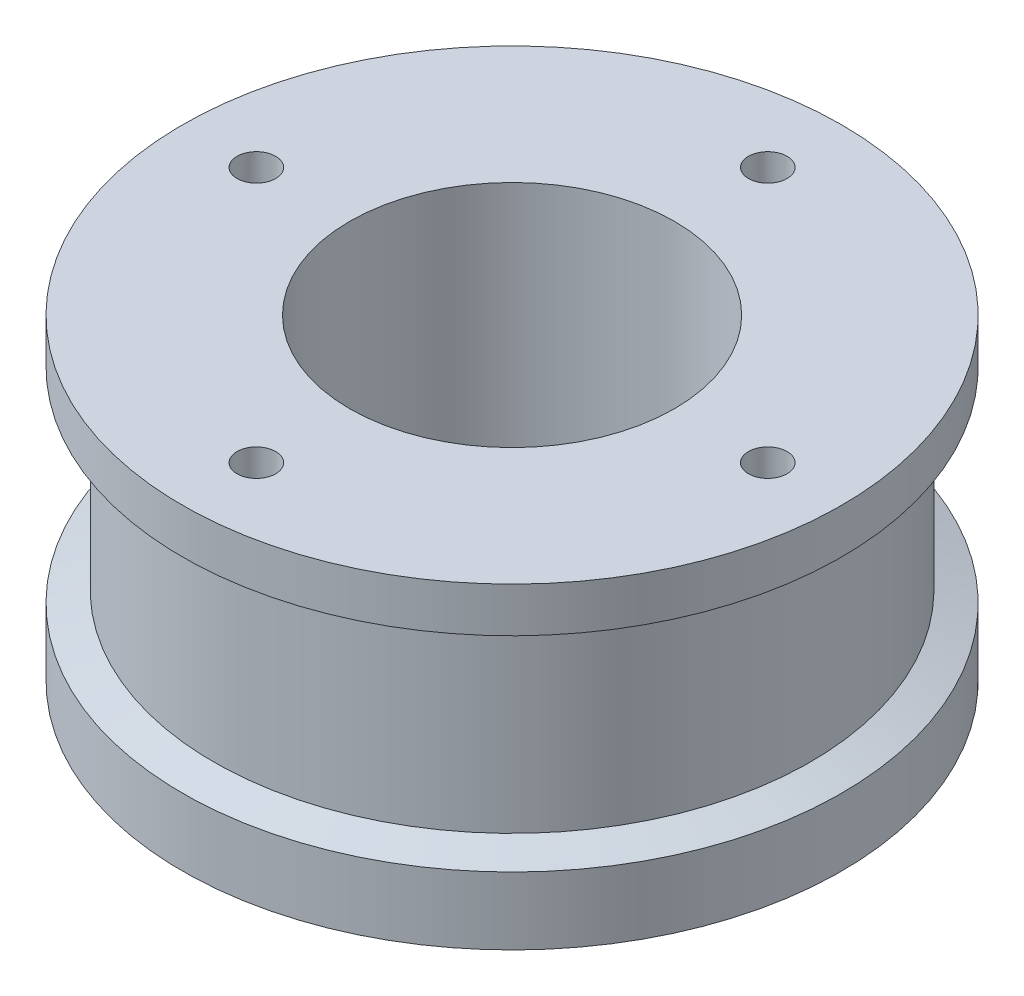
ISO-10303-21;
HEADER;
FILE_DESCRIPTION(('STEP AP214'),'2;1');
FILE_NAME('part.step','',(''),(''),'','','');
FILE_SCHEMA(('AUTOMOTIVE_DESIGN { 1 0 10303 214 1 1 1 1 }'));
ENDSEC;
DATA;
#1=APPLICATION_CONTEXT('core data for automotive mechanical design processes');
#2=APPLICATION_PROTOCOL_DEFINITION('international standard','automotive_design',2000,#1);
#3=PRODUCT_CONTEXT('',#1,'mechanical');
#4=PRODUCT('Part','Part','',(#3));
#5=PRODUCT_RELATED_PRODUCT_CATEGORY('part','',(#4));
#6=PRODUCT_DEFINITION_FORMATION('','',#4);
#7=PRODUCT_DEFINITION_CONTEXT('part definition',#1,'design');
#8=PRODUCT_DEFINITION('design','',#6,#7);
#9=PRODUCT_DEFINITION_SHAPE('','',#8);
#10=(LENGTH_UNIT() NAMED_UNIT(*) SI_UNIT(.MILLI.,.METRE.));
#11=(NAMED_UNIT(*) PLANE_ANGLE_UNIT() SI_UNIT($,.RADIAN.));
#12=(NAMED_UNIT(*) SI_UNIT($,.STERADIAN.) SOLID_ANGLE_UNIT());
#13=UNCERTAINTY_MEASURE_WITH_UNIT(LENGTH_MEASURE(1.E-05),#10,'distance_accuracy_value','');
#14=(GEOMETRIC_REPRESENTATION_CONTEXT(3) GLOBAL_UNCERTAINTY_ASSIGNED_CONTEXT((#13)) GLOBAL_UNIT_ASSIGNED_CONTEXT((#10,
#11,#12)) REPRESENTATION_CONTEXT('',''));
#15=CARTESIAN_POINT('',(0.,0.,0.));
#16=DIRECTION('',(0.,0.,1.));
#17=DIRECTION('',(1.,0.,0.));
#18=AXIS2_PLACEMENT_3D('',#15,#16,#17);
#19=CARTESIAN_POINT('',(0.,0.,0.));
#20=DIRECTION('',(0.,-1.,0.));
#21=DIRECTION('',(0.,0.,-1.));
#22=AXIS2_PLACEMENT_3D('',#19,#20,#21);
#23=CYLINDRICAL_SURFACE('',#22,14.2875);
#24=CARTESIAN_POINT('',(0.,0.,0.));
#25=DIRECTION('',(0.,-1.,0.));
#26=DIRECTION('',(0.,0.,-1.));
#27=AXIS2_PLACEMENT_3D('',#24,#25,#26);
#28=CIRCLE('',#27,14.2875);
#29=CARTESIAN_POINT('',(0.,0.,-14.2875));
#30=VERTEX_POINT('',#29);
#31=EDGE_CURVE('E173',#30,#30,#28,.T.);
#32=ORIENTED_EDGE('',*,*,#31,.T.);
#33=EDGE_LOOP('',(#32));
#34=FACE_BOUND('',#33,.T.);
#35=CARTESIAN_POINT('',(0.,27.8791,0.));
#36=DIRECTION('',(0.,-1.,0.));
#37=DIRECTION('',(0.,0.,-1.));
#38=AXIS2_PLACEMENT_3D('',#35,#36,#37);
#39=CIRCLE('',#38,14.2875);
#40=CARTESIAN_POINT('',(0.,27.8791,-14.2875));
#41=VERTEX_POINT('',#40);
#42=EDGE_CURVE('E11',#41,#41,#39,.T.);
#43=ORIENTED_EDGE('',*,*,#42,.F.);
#44=EDGE_LOOP('',(#43));
#45=FACE_BOUND('',#44,.T.);
#46=ADVANCED_FACE('F47',(#34,#45),#23,.F.);
#47=CARTESIAN_POINT('',(14.2875,27.8791,0.));
#48=DIRECTION('',(0.,1.,0.));
#49=DIRECTION('',(0.,0.,1.));
#50=AXIS2_PLACEMENT_3D('',#47,#48,#49);
#51=PLANE('',#50);
#52=CARTESIAN_POINT('',(0.,27.8791,-22.5));
#53=DIRECTION('',(0.,1.,0.));
#54=DIRECTION('',(0.,0.,1.));
#55=AXIS2_PLACEMENT_3D('',#52,#53,#54);
#56=CIRCLE('',#55,1.7);
#57=CARTESIAN_POINT('',(0.,27.8791,-20.8));
#58=VERTEX_POINT('',#57);
#59=EDGE_CURVE('E121',#58,#58,#56,.T.);
#60=ORIENTED_EDGE('',*,*,#59,.F.);
#61=EDGE_LOOP('',(#60));
#62=FACE_BOUND('',#61,.T.);
#63=CARTESIAN_POINT('',(22.5,27.8791,0.));
#64=DIRECTION('',(0.,1.,0.));
#65=DIRECTION('',(0.,0.,1.));
#66=AXIS2_PLACEMENT_3D('',#63,#64,#65);
#67=CIRCLE('',#66,1.7);
#68=CARTESIAN_POINT('',(22.5,27.8791,1.7));
#69=VERTEX_POINT('',#68);
#70=EDGE_CURVE('E137',#69,#69,#67,.T.);
#71=ORIENTED_EDGE('',*,*,#70,.F.);
#72=EDGE_LOOP('',(#71));
#73=FACE_BOUND('',#72,.T.);
#74=CARTESIAN_POINT('',(-22.5,27.8791,0.));
#75=DIRECTION('',(0.,1.,0.));
#76=DIRECTION('',(0.,0.,1.));
#77=AXIS2_PLACEMENT_3D('',#74,#75,#76);
#78=CIRCLE('',#77,1.7);
#79=CARTESIAN_POINT('',(-22.5,27.8791,1.7));
#80=VERTEX_POINT('',#79);
#81=EDGE_CURVE('E153',#80,#80,#78,.T.);
#82=ORIENTED_EDGE('',*,*,#81,.F.);
#83=EDGE_LOOP('',(#82));
#84=FACE_BOUND('',#83,.T.);
#85=CARTESIAN_POINT('',(0.,27.8791,22.5));
#86=DIRECTION('',(0.,1.,0.));
#87=DIRECTION('',(0.,0.,1.));
#88=AXIS2_PLACEMENT_3D('',#85,#86,#87);
#89=CIRCLE('',#88,1.7);
#90=CARTESIAN_POINT('',(0.,27.8791,24.2));
#91=VERTEX_POINT('',#90);
#92=EDGE_CURVE('E169',#91,#91,#89,.T.);
#93=ORIENTED_EDGE('',*,*,#92,.F.);
#94=EDGE_LOOP('',(#93));
#95=FACE_BOUND('',#94,.T.);
#96=ORIENTED_EDGE('',*,*,#42,.T.);
#97=EDGE_LOOP('',(#96));
#98=FACE_BOUND('',#97,.T.);
#99=CARTESIAN_POINT('',(0.,27.8791,0.));
#100=DIRECTION('',(0.,-1.,0.));
#101=DIRECTION('',(0.,0.,-1.));
#102=AXIS2_PLACEMENT_3D('',#99,#100,#101);
#103=CIRCLE('',#102,29.);
#104=CARTESIAN_POINT('',(0.,27.8791,-29.));
#105=VERTEX_POINT('',#104);
#106=EDGE_CURVE('E55',#105,#105,#103,.T.);
#107=ORIENTED_EDGE('',*,*,#106,.F.);
#108=EDGE_LOOP('',(#107));
#109=FACE_BOUND('',#108,.T.);
#110=ADVANCED_FACE('F204',(#62,#73,#84,#95,#98,#109),#51,.T.);
#111=CARTESIAN_POINT('',(0.,0.,0.));
#112=DIRECTION('',(0.,-1.,0.));
#113=DIRECTION('',(0.,0.,-1.));
#114=AXIS2_PLACEMENT_3D('',#111,#112,#113);
#115=CYLINDRICAL_SURFACE('',#114,29.);
#116=ORIENTED_EDGE('',*,*,#106,.T.);
#117=EDGE_LOOP('',(#116));
#118=FACE_BOUND('',#117,.T.);
#119=CARTESIAN_POINT('',(0.,23.940468144232,0.));
#120=DIRECTION('',(0.,-1.,0.));
#121=DIRECTION('',(0.,0.,-1.));
#122=AXIS2_PLACEMENT_3D('',#119,#120,#121);
#123=CIRCLE('',#122,29.);
#124=CARTESIAN_POINT('',(0.,23.940468144232,-29.));
#125=VERTEX_POINT('',#124);
#126=EDGE_CURVE('E193',#125,#125,#123,.T.);
#127=ORIENTED_EDGE('',*,*,#126,.F.);
#128=EDGE_LOOP('',(#127));
#129=FACE_BOUND('',#128,.T.);
#130=ADVANCED_FACE('F201',(#118,#129),#115,.T.);
#131=CARTESIAN_POINT('',(0.,22.93955,0.));
#132=DIRECTION('',(0.,1.,0.));
#133=DIRECTION('',(0.,0.,1.));
#134=AXIS2_PLACEMENT_3D('',#131,#132,#133);
#135=CONICAL_SURFACE('',#134,26.25,1.22173047639603);
#136=ORIENTED_EDGE('',*,*,#126,.T.);
#137=EDGE_LOOP('',(#136));
#138=FACE_BOUND('',#137,.T.);
#139=CARTESIAN_POINT('',(0.,22.93955,0.));
#140=DIRECTION('',(0.,-1.,0.));
#141=DIRECTION('',(0.,0.,-1.));
#142=AXIS2_PLACEMENT_3D('',#139,#140,#141);
#143=CIRCLE('',#142,26.25);
#144=CARTESIAN_POINT('',(0.,22.93955,-26.25));
#145=VERTEX_POINT('',#144);
#146=EDGE_CURVE('E189',#145,#145,#143,.T.);
#147=ORIENTED_EDGE('',*,*,#146,.F.);
#148=EDGE_LOOP('',(#147));
#149=FACE_BOUND('',#148,.T.);
#150=ADVANCED_FACE('F212',(#138,#149),#135,.T.);
#151=CARTESIAN_POINT('',(0.,0.,0.));
#152=DIRECTION('',(0.,-1.,0.));
#153=DIRECTION('',(0.,0.,-1.));
#154=AXIS2_PLACEMENT_3D('',#151,#152,#153);
#155=CYLINDRICAL_SURFACE('',#154,26.25);
#156=ORIENTED_EDGE('',*,*,#146,.T.);
#157=EDGE_LOOP('',(#156));
#158=FACE_BOUND('',#157,.T.);
#159=CARTESIAN_POINT('',(0.,6.93955,0.));
#160=DIRECTION('',(0.,-1.,0.));
#161=DIRECTION('',(0.,0.,-1.));
#162=AXIS2_PLACEMENT_3D('',#159,#160,#161);
#163=CIRCLE('',#162,26.25);
#164=CARTESIAN_POINT('',(0.,6.93955,-26.25));
#165=VERTEX_POINT('',#164);
#166=EDGE_CURVE('E185',#165,#165,#163,.T.);
#167=ORIENTED_EDGE('',*,*,#166,.F.);
#168=EDGE_LOOP('',(#167));
#169=FACE_BOUND('',#168,.T.);
#170=ADVANCED_FACE('F221',(#158,#169),#155,.T.);
#171=CARTESIAN_POINT('',(0.,5.93863185576794,0.));
#172=DIRECTION('',(0.,-1.,0.));
#173=DIRECTION('',(0.,0.,-1.));
#174=AXIS2_PLACEMENT_3D('',#171,#172,#173);
#175=CONICAL_SURFACE('',#174,29.,1.22173047639603);
#176=ORIENTED_EDGE('',*,*,#166,.T.);
#177=EDGE_LOOP('',(#176));
#178=FACE_BOUND('',#177,.T.);
#179=CARTESIAN_POINT('',(0.,5.93863185576794,0.));
#180=DIRECTION('',(0.,-1.,0.));
#181=DIRECTION('',(0.,0.,-1.));
#182=AXIS2_PLACEMENT_3D('',#179,#180,#181);
#183=CIRCLE('',#182,29.);
#184=CARTESIAN_POINT('',(0.,5.93863185576794,-29.));
#185=VERTEX_POINT('',#184);
#186=EDGE_CURVE('E181',#185,#185,#183,.T.);
#187=ORIENTED_EDGE('',*,*,#186,.F.);
#188=EDGE_LOOP('',(#187));
#189=FACE_BOUND('',#188,.T.);
#190=ADVANCED_FACE('F224',(#178,#189),#175,.T.);
#191=CARTESIAN_POINT('',(0.,0.,0.));
#192=DIRECTION('',(0.,-1.,0.));
#193=DIRECTION('',(0.,0.,-1.));
#194=AXIS2_PLACEMENT_3D('',#191,#192,#193);
#195=CYLINDRICAL_SURFACE('',#194,29.);
#196=ORIENTED_EDGE('',*,*,#186,.T.);
#197=EDGE_LOOP('',(#196));
#198=FACE_BOUND('',#197,.T.);
#199=CARTESIAN_POINT('',(0.,0.,0.));
#200=DIRECTION('',(0.,-1.,0.));
#201=DIRECTION('',(0.,0.,-1.));
#202=AXIS2_PLACEMENT_3D('',#199,#200,#201);
#203=CIRCLE('',#202,29.);
#204=CARTESIAN_POINT('',(0.,0.,-29.));
#205=VERTEX_POINT('',#204);
#206=EDGE_CURVE('E177',#205,#205,#203,.T.);
#207=ORIENTED_EDGE('',*,*,#206,.F.);
#208=EDGE_LOOP('',(#207));
#209=FACE_BOUND('',#208,.T.);
#210=ADVANCED_FACE('F228',(#198,#209),#195,.T.);
#211=CARTESIAN_POINT('',(29.,0.,0.));
#212=DIRECTION('',(0.,-1.,0.));
#213=DIRECTION('',(0.,0.,-1.));
#214=AXIS2_PLACEMENT_3D('',#211,#212,#213);
#215=PLANE('',#214);
#216=CARTESIAN_POINT('',(-11.90625,0.,-20.6222299276169));
#217=DIRECTION('',(0.,-1.,0.));
#218=DIRECTION('',(0.,0.,-1.));
#219=AXIS2_PLACEMENT_3D('',#216,#217,#218);
#220=CIRCLE('',#219,3.2639);
#221=CARTESIAN_POINT('',(-11.90625,0.,-23.8861299276169));
#222=VERTEX_POINT('',#221);
#223=EDGE_CURVE('E80',#222,#222,#220,.T.);
#224=ORIENTED_EDGE('',*,*,#223,.F.);
#225=EDGE_LOOP('',(#224));
#226=FACE_BOUND('',#225,.T.);
#227=CARTESIAN_POINT('',(11.90625,0.,-20.6222299276169));
#228=DIRECTION('',(0.,-1.,0.));
#229=DIRECTION('',(0.,0.,-1.));
#230=AXIS2_PLACEMENT_3D('',#227,#228,#229);
#231=CIRCLE('',#230,3.2639);
#232=CARTESIAN_POINT('',(11.90625,0.,-23.886129927617));
#233=VERTEX_POINT('',#232);
#234=EDGE_CURVE('E79',#233,#233,#231,.T.);
#235=ORIENTED_EDGE('',*,*,#234,.F.);
#236=EDGE_LOOP('',(#235));
#237=FACE_BOUND('',#236,.T.);
#238=CARTESIAN_POINT('',(11.90625,0.,20.6222299276169));
#239=DIRECTION('',(0.,-1.,0.));
#240=DIRECTION('',(0.,0.,-1.));
#241=AXIS2_PLACEMENT_3D('',#238,#239,#240);
#242=CIRCLE('',#241,3.2639);
#243=CARTESIAN_POINT('',(11.90625,0.,17.3583299276169));
#244=VERTEX_POINT('',#243);
#245=EDGE_CURVE('E93',#244,#244,#242,.T.);
#246=ORIENTED_EDGE('',*,*,#245,.F.);
#247=EDGE_LOOP('',(#246));
#248=FACE_BOUND('',#247,.T.);
#249=CARTESIAN_POINT('',(-11.90625,0.,20.622229927617));
#250=DIRECTION('',(0.,-1.,0.));
#251=DIRECTION('',(0.,0.,-1.));
#252=AXIS2_PLACEMENT_3D('',#249,#250,#251);
#253=CIRCLE('',#252,3.2639);
#254=CARTESIAN_POINT('',(-11.90625,0.,17.358329927617));
#255=VERTEX_POINT('',#254);
#256=EDGE_CURVE('E101',#255,#255,#253,.T.);
#257=ORIENTED_EDGE('',*,*,#256,.F.);
#258=EDGE_LOOP('',(#257));
#259=FACE_BOUND('',#258,.T.);
#260=CARTESIAN_POINT('',(0.,0.,-22.5));
#261=DIRECTION('',(0.,-1.,0.));
#262=DIRECTION('',(0.,0.,-1.));
#263=AXIS2_PLACEMENT_3D('',#260,#261,#262);
#264=CIRCLE('',#263,3.35);
#265=CARTESIAN_POINT('',(0.,0.,-25.85));
#266=VERTEX_POINT('',#265);
#267=EDGE_CURVE('E109',#266,#266,#264,.T.);
#268=ORIENTED_EDGE('',*,*,#267,.F.);
#269=EDGE_LOOP('',(#268));
#270=FACE_BOUND('',#269,.T.);
#271=CARTESIAN_POINT('',(22.5,0.,0.));
#272=DIRECTION('',(0.,-1.,0.));
#273=DIRECTION('',(0.,0.,-1.));
#274=AXIS2_PLACEMENT_3D('',#271,#272,#273);
#275=CIRCLE('',#274,3.35);
#276=CARTESIAN_POINT('',(22.5,0.,-3.35));
#277=VERTEX_POINT('',#276);
#278=EDGE_CURVE('E125',#277,#277,#275,.T.);
#279=ORIENTED_EDGE('',*,*,#278,.F.);
#280=EDGE_LOOP('',(#279));
#281=FACE_BOUND('',#280,.T.);
#282=CARTESIAN_POINT('',(-22.5,0.,0.));
#283=DIRECTION('',(0.,-1.,0.));
#284=DIRECTION('',(0.,0.,-1.));
#285=AXIS2_PLACEMENT_3D('',#282,#283,#284);
#286=CIRCLE('',#285,3.35);
#287=CARTESIAN_POINT('',(-22.5,0.,-3.35));
#288=VERTEX_POINT('',#287);
#289=EDGE_CURVE('E141',#288,#288,#286,.T.);
#290=ORIENTED_EDGE('',*,*,#289,.F.);
#291=EDGE_LOOP('',(#290));
#292=FACE_BOUND('',#291,.T.);
#293=CARTESIAN_POINT('',(0.,0.,22.5));
#294=DIRECTION('',(0.,-1.,0.));
#295=DIRECTION('',(0.,0.,-1.));
#296=AXIS2_PLACEMENT_3D('',#293,#294,#295);
#297=CIRCLE('',#296,3.35);
#298=CARTESIAN_POINT('',(0.,0.,19.15));
#299=VERTEX_POINT('',#298);
#300=EDGE_CURVE('E157',#299,#299,#297,.T.);
#301=ORIENTED_EDGE('',*,*,#300,.F.);
#302=EDGE_LOOP('',(#301));
#303=FACE_BOUND('',#302,.T.);
#304=ORIENTED_EDGE('',*,*,#206,.T.);
#305=EDGE_LOOP('',(#304));
#306=FACE_BOUND('',#305,.T.);
#307=ORIENTED_EDGE('',*,*,#31,.F.);
#308=EDGE_LOOP('',(#307));
#309=FACE_BOUND('',#308,.T.);
#310=ADVANCED_FACE('F232',(#226,#237,#248,#259,#270,#281,#292,#303,#306,#309),#215,.T.);
#311=CARTESIAN_POINT('',(0.,0.,22.5));
#312=DIRECTION('',(0.,-1.,0.));
#313=DIRECTION('',(0.,0.,-1.));
#314=AXIS2_PLACEMENT_3D('',#311,#312,#313);
#315=CYLINDRICAL_SURFACE('',#314,1.7);
#316=CARTESIAN_POINT('',(0.,2.15,22.5));
#317=DIRECTION('',(0.,-1.,0.));
#318=DIRECTION('',(0.,0.,-1.));
#319=AXIS2_PLACEMENT_3D('',#316,#317,#318);
#320=CIRCLE('',#319,1.7);
#321=CARTESIAN_POINT('',(0.,2.15,20.8));
#322=VERTEX_POINT('',#321);
#323=EDGE_CURVE('E165',#322,#322,#320,.T.);
#324=ORIENTED_EDGE('',*,*,#323,.T.);
#325=EDGE_LOOP('',(#324));
#326=FACE_BOUND('',#325,.T.);
#327=ORIENTED_EDGE('',*,*,#92,.T.);
#328=EDGE_LOOP('',(#327));
#329=FACE_BOUND('',#328,.T.);
#330=ADVANCED_FACE('F236',(#326,#329),#315,.F.);
#331=CARTESIAN_POINT('',(1.7,2.15,22.5));
#332=DIRECTION('',(0.,1.,0.));
#333=DIRECTION('',(0.,0.,1.));
#334=AXIS2_PLACEMENT_3D('',#331,#332,#333);
#335=PLANE('',#334);
#336=ORIENTED_EDGE('',*,*,#323,.F.);
#337=EDGE_LOOP('',(#336));
#338=FACE_BOUND('',#337,.T.);
#339=CARTESIAN_POINT('',(0.,2.15,22.5));
#340=DIRECTION('',(0.,-1.,0.));
#341=DIRECTION('',(0.,0.,-1.));
#342=AXIS2_PLACEMENT_3D('',#339,#340,#341);
#343=CIRCLE('',#342,3.35);
#344=CARTESIAN_POINT('',(0.,2.15,19.15));
#345=VERTEX_POINT('',#344);
#346=EDGE_CURVE('E161',#345,#345,#343,.T.);
#347=ORIENTED_EDGE('',*,*,#346,.T.);
#348=EDGE_LOOP('',(#347));
#349=FACE_BOUND('',#348,.T.);
#350=ADVANCED_FACE('F240',(#338,#349),#335,.F.);
#351=CARTESIAN_POINT('',(0.,0.,22.5));
#352=DIRECTION('',(0.,-1.,0.));
#353=DIRECTION('',(0.,0.,-1.));
#354=AXIS2_PLACEMENT_3D('',#351,#352,#353);
#355=CYLINDRICAL_SURFACE('',#354,3.35);
#356=ORIENTED_EDGE('',*,*,#346,.F.);
#357=EDGE_LOOP('',(#356));
#358=FACE_BOUND('',#357,.T.);
#359=ORIENTED_EDGE('',*,*,#300,.T.);
#360=EDGE_LOOP('',(#359));
#361=FACE_BOUND('',#360,.T.);
#362=ADVANCED_FACE('F244',(#358,#361),#355,.F.);
#363=CARTESIAN_POINT('',(-22.5,0.,0.));
#364=DIRECTION('',(0.,-1.,0.));
#365=DIRECTION('',(0.,0.,-1.));
#366=AXIS2_PLACEMENT_3D('',#363,#364,#365);
#367=CYLINDRICAL_SURFACE('',#366,1.7);
#368=CARTESIAN_POINT('',(-22.5,2.15,0.));
#369=DIRECTION('',(0.,-1.,0.));
#370=DIRECTION('',(0.,0.,-1.));
#371=AXIS2_PLACEMENT_3D('',#368,#369,#370);
#372=CIRCLE('',#371,1.7);
#373=CARTESIAN_POINT('',(-22.5,2.15,-1.7));
#374=VERTEX_POINT('',#373);
#375=EDGE_CURVE('E149',#374,#374,#372,.T.);
#376=ORIENTED_EDGE('',*,*,#375,.T.);
#377=EDGE_LOOP('',(#376));
#378=FACE_BOUND('',#377,.T.);
#379=ORIENTED_EDGE('',*,*,#81,.T.);
#380=EDGE_LOOP('',(#379));
#381=FACE_BOUND('',#380,.T.);
#382=ADVANCED_FACE('F248',(#378,#381),#367,.F.);
#383=CARTESIAN_POINT('',(-20.8,2.15,0.));
#384=DIRECTION('',(0.,1.,0.));
#385=DIRECTION('',(0.,0.,1.));
#386=AXIS2_PLACEMENT_3D('',#383,#384,#385);
#387=PLANE('',#386);
#388=ORIENTED_EDGE('',*,*,#375,.F.);
#389=EDGE_LOOP('',(#388));
#390=FACE_BOUND('',#389,.T.);
#391=CARTESIAN_POINT('',(-22.5,2.15,0.));
#392=DIRECTION('',(0.,-1.,0.));
#393=DIRECTION('',(0.,0.,-1.));
#394=AXIS2_PLACEMENT_3D('',#391,#392,#393);
#395=CIRCLE('',#394,3.35);
#396=CARTESIAN_POINT('',(-22.5,2.15,-3.35));
#397=VERTEX_POINT('',#396);
#398=EDGE_CURVE('E145',#397,#397,#395,.T.);
#399=ORIENTED_EDGE('',*,*,#398,.T.);
#400=EDGE_LOOP('',(#399));
#401=FACE_BOUND('',#400,.T.);
#402=ADVANCED_FACE('F252',(#390,#401),#387,.F.);
#403=CARTESIAN_POINT('',(-22.5,0.,0.));
#404=DIRECTION('',(0.,-1.,0.));
#405=DIRECTION('',(0.,0.,-1.));
#406=AXIS2_PLACEMENT_3D('',#403,#404,#405);
#407=CYLINDRICAL_SURFACE('',#406,3.35);
#408=ORIENTED_EDGE('',*,*,#398,.F.);
#409=EDGE_LOOP('',(#408));
#410=FACE_BOUND('',#409,.T.);
#411=ORIENTED_EDGE('',*,*,#289,.T.);
#412=EDGE_LOOP('',(#411));
#413=FACE_BOUND('',#412,.T.);
#414=ADVANCED_FACE('F256',(#410,#413),#407,.F.);
#415=CARTESIAN_POINT('',(22.5,0.,0.));
#416=DIRECTION('',(0.,-1.,0.));
#417=DIRECTION('',(0.,0.,-1.));
#418=AXIS2_PLACEMENT_3D('',#415,#416,#417);
#419=CYLINDRICAL_SURFACE('',#418,1.7);
#420=CARTESIAN_POINT('',(22.5,2.15,0.));
#421=DIRECTION('',(0.,-1.,0.));
#422=DIRECTION('',(0.,0.,-1.));
#423=AXIS2_PLACEMENT_3D('',#420,#421,#422);
#424=CIRCLE('',#423,1.7);
#425=CARTESIAN_POINT('',(22.5,2.15,-1.7));
#426=VERTEX_POINT('',#425);
#427=EDGE_CURVE('E133',#426,#426,#424,.T.);
#428=ORIENTED_EDGE('',*,*,#427,.T.);
#429=EDGE_LOOP('',(#428));
#430=FACE_BOUND('',#429,.T.);
#431=ORIENTED_EDGE('',*,*,#70,.T.);
#432=EDGE_LOOP('',(#431));
#433=FACE_BOUND('',#432,.T.);
#434=ADVANCED_FACE('F260',(#430,#433),#419,.F.);
#435=CARTESIAN_POINT('',(24.2,2.15,0.));
#436=DIRECTION('',(0.,1.,0.));
#437=DIRECTION('',(0.,0.,1.));
#438=AXIS2_PLACEMENT_3D('',#435,#436,#437);
#439=PLANE('',#438);
#440=ORIENTED_EDGE('',*,*,#427,.F.);
#441=EDGE_LOOP('',(#440));
#442=FACE_BOUND('',#441,.T.);
#443=CARTESIAN_POINT('',(22.5,2.15,0.));
#444=DIRECTION('',(0.,-1.,0.));
#445=DIRECTION('',(0.,0.,-1.));
#446=AXIS2_PLACEMENT_3D('',#443,#444,#445);
#447=CIRCLE('',#446,3.35);
#448=CARTESIAN_POINT('',(22.5,2.15,-3.35));
#449=VERTEX_POINT('',#448);
#450=EDGE_CURVE('E129',#449,#449,#447,.T.);
#451=ORIENTED_EDGE('',*,*,#450,.T.);
#452=EDGE_LOOP('',(#451));
#453=FACE_BOUND('',#452,.T.);
#454=ADVANCED_FACE('F264',(#442,#453),#439,.F.);
#455=CARTESIAN_POINT('',(22.5,0.,0.));
#456=DIRECTION('',(0.,-1.,0.));
#457=DIRECTION('',(0.,0.,-1.));
#458=AXIS2_PLACEMENT_3D('',#455,#456,#457);
#459=CYLINDRICAL_SURFACE('',#458,3.35);
#460=ORIENTED_EDGE('',*,*,#450,.F.);
#461=EDGE_LOOP('',(#460));
#462=FACE_BOUND('',#461,.T.);
#463=ORIENTED_EDGE('',*,*,#278,.T.);
#464=EDGE_LOOP('',(#463));
#465=FACE_BOUND('',#464,.T.);
#466=ADVANCED_FACE('F268',(#462,#465),#459,.F.);
#467=CARTESIAN_POINT('',(0.,0.,-22.5));
#468=DIRECTION('',(0.,-1.,0.));
#469=DIRECTION('',(0.,0.,-1.));
#470=AXIS2_PLACEMENT_3D('',#467,#468,#469);
#471=CYLINDRICAL_SURFACE('',#470,1.7);
#472=CARTESIAN_POINT('',(0.,2.15,-22.5));
#473=DIRECTION('',(0.,-1.,0.));
#474=DIRECTION('',(0.,0.,-1.));
#475=AXIS2_PLACEMENT_3D('',#472,#473,#474);
#476=CIRCLE('',#475,1.7);
#477=CARTESIAN_POINT('',(0.,2.15,-24.2));
#478=VERTEX_POINT('',#477);
#479=EDGE_CURVE('E117',#478,#478,#476,.T.);
#480=ORIENTED_EDGE('',*,*,#479,.T.);
#481=EDGE_LOOP('',(#480));
#482=FACE_BOUND('',#481,.T.);
#483=ORIENTED_EDGE('',*,*,#59,.T.);
#484=EDGE_LOOP('',(#483));
#485=FACE_BOUND('',#484,.T.);
#486=ADVANCED_FACE('F272',(#482,#485),#471,.F.);
#487=CARTESIAN_POINT('',(1.7,2.15,-22.5));
#488=DIRECTION('',(0.,1.,0.));
#489=DIRECTION('',(0.,0.,1.));
#490=AXIS2_PLACEMENT_3D('',#487,#488,#489);
#491=PLANE('',#490);
#492=ORIENTED_EDGE('',*,*,#479,.F.);
#493=EDGE_LOOP('',(#492));
#494=FACE_BOUND('',#493,.T.);
#495=CARTESIAN_POINT('',(0.,2.15,-22.5));
#496=DIRECTION('',(0.,-1.,0.));
#497=DIRECTION('',(0.,0.,-1.));
#498=AXIS2_PLACEMENT_3D('',#495,#496,#497);
#499=CIRCLE('',#498,3.35);
#500=CARTESIAN_POINT('',(0.,2.15,-25.85));
#501=VERTEX_POINT('',#500);
#502=EDGE_CURVE('E113',#501,#501,#499,.T.);
#503=ORIENTED_EDGE('',*,*,#502,.T.);
#504=EDGE_LOOP('',(#503));
#505=FACE_BOUND('',#504,.T.);
#506=ADVANCED_FACE('F276',(#494,#505),#491,.F.);
#507=CARTESIAN_POINT('',(0.,0.,-22.5));
#508=DIRECTION('',(0.,-1.,0.));
#509=DIRECTION('',(0.,0.,-1.));
#510=AXIS2_PLACEMENT_3D('',#507,#508,#509);
#511=CYLINDRICAL_SURFACE('',#510,3.35);
#512=ORIENTED_EDGE('',*,*,#502,.F.);
#513=EDGE_LOOP('',(#512));
#514=FACE_BOUND('',#513,.T.);
#515=ORIENTED_EDGE('',*,*,#267,.T.);
#516=EDGE_LOOP('',(#515));
#517=FACE_BOUND('',#516,.T.);
#518=ADVANCED_FACE('F280',(#514,#517),#511,.F.);
#519=CARTESIAN_POINT('',(-11.90625,6.35,20.622229927617));
#520=DIRECTION('',(0.,-1.,0.));
#521=DIRECTION('',(0.,0.,-1.));
#522=AXIS2_PLACEMENT_3D('',#519,#520,#521);
#523=CONICAL_SURFACE('',#522,3.2639,1.02974425867665);
#524=CARTESIAN_POINT('',(-11.90625,8.31114897444405,20.622229927617));
#525=VERTEX_POINT('',#524);
#526=VERTEX_LOOP('',#525);
#527=FACE_BOUND('',#526,.T.);
#528=CARTESIAN_POINT('',(-11.90625,6.35,20.622229927617));
#529=DIRECTION('',(0.,-1.,0.));
#530=DIRECTION('',(0.,0.,-1.));
#531=AXIS2_PLACEMENT_3D('',#528,#529,#530);
#532=CIRCLE('',#531,3.2639);
#533=CARTESIAN_POINT('',(-11.90625,6.35,17.358329927617));
#534=VERTEX_POINT('',#533);
#535=EDGE_CURVE('E105',#534,#534,#532,.T.);
#536=ORIENTED_EDGE('',*,*,#535,.T.);
#537=EDGE_LOOP('',(#536));
#538=FACE_BOUND('',#537,.T.);
#539=ADVANCED_FACE('F284',(#527,#538),#523,.F.);
#540=CARTESIAN_POINT('',(-11.90625,0.,20.622229927617));
#541=DIRECTION('',(0.,-1.,0.));
#542=DIRECTION('',(0.,0.,-1.));
#543=AXIS2_PLACEMENT_3D('',#540,#541,#542);
#544=CYLINDRICAL_SURFACE('',#543,3.2639);
#545=ORIENTED_EDGE('',*,*,#535,.F.);
#546=EDGE_LOOP('',(#545));
#547=FACE_BOUND('',#546,.T.);
#548=ORIENTED_EDGE('',*,*,#256,.T.);
#549=EDGE_LOOP('',(#548));
#550=FACE_BOUND('',#549,.T.);
#551=ADVANCED_FACE('F288',(#547,#550),#544,.F.);
#552=CARTESIAN_POINT('',(11.90625,6.35,20.6222299276169));
#553=DIRECTION('',(0.,-1.,0.));
#554=DIRECTION('',(0.,0.,-1.));
#555=AXIS2_PLACEMENT_3D('',#552,#553,#554);
#556=CONICAL_SURFACE('',#555,3.2639,1.02974425867665);
#557=CARTESIAN_POINT('',(11.90625,8.31114897444405,20.6222299276169));
#558=VERTEX_POINT('',#557);
#559=VERTEX_LOOP('',#558);
#560=FACE_BOUND('',#559,.T.);
#561=CARTESIAN_POINT('',(11.90625,6.35,20.6222299276169));
#562=DIRECTION('',(0.,-1.,0.));
#563=DIRECTION('',(0.,0.,-1.));
#564=AXIS2_PLACEMENT_3D('',#561,#562,#563);
#565=CIRCLE('',#564,3.2639);
#566=CARTESIAN_POINT('',(11.90625,6.35,17.3583299276169));
#567=VERTEX_POINT('',#566);
#568=EDGE_CURVE('E97',#567,#567,#565,.T.);
#569=ORIENTED_EDGE('',*,*,#568,.T.);
#570=EDGE_LOOP('',(#569));
#571=FACE_BOUND('',#570,.T.);
#572=ADVANCED_FACE('F290',(#560,#571),#556,.F.);
#573=CARTESIAN_POINT('',(11.90625,0.,20.6222299276169));
#574=DIRECTION('',(0.,-1.,0.));
#575=DIRECTION('',(0.,0.,-1.));
#576=AXIS2_PLACEMENT_3D('',#573,#574,#575);
#577=CYLINDRICAL_SURFACE('',#576,3.2639);
#578=ORIENTED_EDGE('',*,*,#568,.F.);
#579=EDGE_LOOP('',(#578));
#580=FACE_BOUND('',#579,.T.);
#581=ORIENTED_EDGE('',*,*,#245,.T.);
#582=EDGE_LOOP('',(#581));
#583=FACE_BOUND('',#582,.T.);
#584=ADVANCED_FACE('F294',(#580,#583),#577,.F.);
#585=CARTESIAN_POINT('',(11.90625,6.35,-20.6222299276169));
#586=DIRECTION('',(0.,-1.,0.));
#587=DIRECTION('',(0.,0.,-1.));
#588=AXIS2_PLACEMENT_3D('',#585,#586,#587);
#589=CONICAL_SURFACE('',#588,3.2639,1.02974425867665);
#590=CARTESIAN_POINT('',(11.90625,8.31114897444405,-20.6222299276169));
#591=VERTEX_POINT('',#590);
#592=VERTEX_LOOP('',#591);
#593=FACE_BOUND('',#592,.T.);
#594=CARTESIAN_POINT('',(11.90625,6.35,-20.6222299276169));
#595=DIRECTION('',(0.,-1.,0.));
#596=DIRECTION('',(0.,0.,-1.));
#597=AXIS2_PLACEMENT_3D('',#594,#595,#596);
#598=CIRCLE('',#597,3.2639);
#599=CARTESIAN_POINT('',(11.90625,6.35,-23.886129927617));
#600=VERTEX_POINT('',#599);
#601=EDGE_CURVE('E85',#600,#600,#598,.T.);
#602=ORIENTED_EDGE('',*,*,#601,.T.);
#603=EDGE_LOOP('',(#602));
#604=FACE_BOUND('',#603,.T.);
#605=ADVANCED_FACE('F297',(#593,#604),#589,.F.);
#606=CARTESIAN_POINT('',(11.90625,0.,-20.6222299276169));
#607=DIRECTION('',(0.,-1.,0.));
#608=DIRECTION('',(0.,0.,-1.));
#609=AXIS2_PLACEMENT_3D('',#606,#607,#608);
#610=CYLINDRICAL_SURFACE('',#609,3.2639);
#611=ORIENTED_EDGE('',*,*,#601,.F.);
#612=EDGE_LOOP('',(#611));
#613=FACE_BOUND('',#612,.T.);
#614=ORIENTED_EDGE('',*,*,#234,.T.);
#615=EDGE_LOOP('',(#614));
#616=FACE_BOUND('',#615,.T.);
#617=ADVANCED_FACE('F72',(#613,#616),#610,.F.);
#618=CARTESIAN_POINT('',(-11.90625,6.35,-20.6222299276169));
#619=DIRECTION('',(0.,-1.,0.));
#620=DIRECTION('',(0.,0.,-1.));
#621=AXIS2_PLACEMENT_3D('',#618,#619,#620);
#622=CONICAL_SURFACE('',#621,3.2639,1.02974425867665);
#623=CARTESIAN_POINT('',(-11.90625,8.31114897444405,-20.6222299276169));
#624=VERTEX_POINT('',#623);
#625=VERTEX_LOOP('',#624);
#626=FACE_BOUND('',#625,.T.);
#627=CARTESIAN_POINT('',(-11.90625,6.35,-20.6222299276169));
#628=DIRECTION('',(0.,-1.,0.));
#629=DIRECTION('',(0.,0.,-1.));
#630=AXIS2_PLACEMENT_3D('',#627,#628,#629);
#631=CIRCLE('',#630,3.2639);
#632=CARTESIAN_POINT('',(-11.90625,6.35,-23.8861299276169));
#633=VERTEX_POINT('',#632);
#634=EDGE_CURVE('E76',#633,#633,#631,.T.);
#635=ORIENTED_EDGE('',*,*,#634,.T.);
#636=EDGE_LOOP('',(#635));
#637=FACE_BOUND('',#636,.T.);
#638=ADVANCED_FACE('F68',(#626,#637),#622,.F.);
#639=CARTESIAN_POINT('',(-11.90625,0.,-20.6222299276169));
#640=DIRECTION('',(0.,-1.,0.));
#641=DIRECTION('',(0.,0.,-1.));
#642=AXIS2_PLACEMENT_3D('',#639,#640,#641);
#643=CYLINDRICAL_SURFACE('',#642,3.2639);
#644=ORIENTED_EDGE('',*,*,#634,.F.);
#645=EDGE_LOOP('',(#644));
#646=FACE_BOUND('',#645,.T.);
#647=ORIENTED_EDGE('',*,*,#223,.T.);
#648=EDGE_LOOP('',(#647));
#649=FACE_BOUND('',#648,.T.);
#650=ADVANCED_FACE('F71',(#646,#649),#643,.F.);
#651=CLOSED_SHELL('',(#46,#110,#130,#150,#170,#190,#210,#310,#330,#350,#362,#382,#402,#414,#434,
#454,#466,#486,#506,#518,#539,#551,#572,#584,#605,#617,#638,#650));
#652=MANIFOLD_SOLID_BREP('B2',#651);
#653=ADVANCED_BREP_SHAPE_REPRESENTATION('',(#18,#652),#14);
#654=SHAPE_DEFINITION_REPRESENTATION(#9,#653);
ENDSEC;
END-ISO-10303-21;
